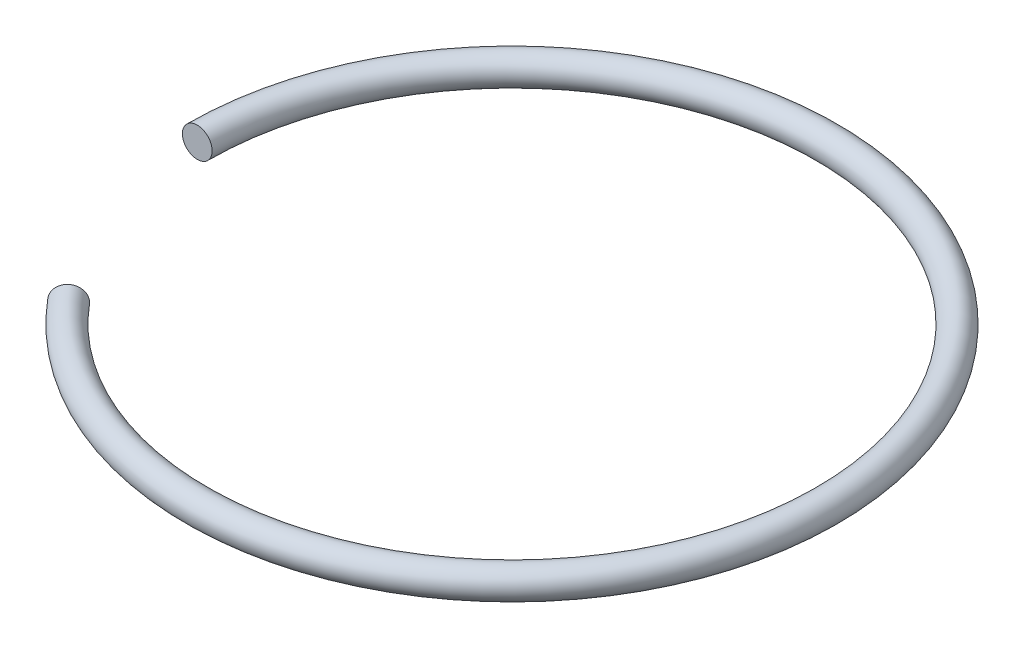
ISO-10303-21;
HEADER;
FILE_DESCRIPTION(('STEP AP214'),'2;1');
FILE_NAME('part.step','',(''),(''),'','','');
FILE_SCHEMA(('AUTOMOTIVE_DESIGN { 1 0 10303 214 1 1 1 1 }'));
ENDSEC;
DATA;
#1=APPLICATION_CONTEXT('core data for automotive mechanical design processes');
#2=APPLICATION_PROTOCOL_DEFINITION('international standard','automotive_design',2000,#1);
#3=PRODUCT_CONTEXT('',#1,'mechanical');
#4=PRODUCT('Part','Part','',(#3));
#5=PRODUCT_RELATED_PRODUCT_CATEGORY('part','',(#4));
#6=PRODUCT_DEFINITION_FORMATION('','',#4);
#7=PRODUCT_DEFINITION_CONTEXT('part definition',#1,'design');
#8=PRODUCT_DEFINITION('design','',#6,#7);
#9=PRODUCT_DEFINITION_SHAPE('','',#8);
#10=(LENGTH_UNIT() NAMED_UNIT(*) SI_UNIT(.MILLI.,.METRE.));
#11=(NAMED_UNIT(*) PLANE_ANGLE_UNIT() SI_UNIT($,.RADIAN.));
#12=(NAMED_UNIT(*) SI_UNIT($,.STERADIAN.) SOLID_ANGLE_UNIT());
#13=UNCERTAINTY_MEASURE_WITH_UNIT(LENGTH_MEASURE(1.E-05),#10,'distance_accuracy_value','');
#14=(GEOMETRIC_REPRESENTATION_CONTEXT(3) GLOBAL_UNCERTAINTY_ASSIGNED_CONTEXT((#13)) GLOBAL_UNIT_ASSIGNED_CONTEXT((#10,
#11,#12)) REPRESENTATION_CONTEXT('',''));
#15=CARTESIAN_POINT('',(0.,0.,0.));
#16=DIRECTION('',(0.,0.,1.));
#17=DIRECTION('',(1.,0.,0.));
#18=AXIS2_PLACEMENT_3D('',#15,#16,#17);
#19=CARTESIAN_POINT('',(0.,2.794,0.));
#20=DIRECTION('',(0.,0.,1.));
#21=DIRECTION('',(1.,0.,0.));
#22=AXIS2_PLACEMENT_3D('',#19,#20,#21);
#23=PLANE('',#22);
#24=CARTESIAN_POINT('',(-2.55905,0.381,0.));
#25=CARTESIAN_POINT('',(-2.55905899992696,0.366769642926091,0.));
#26=CARTESIAN_POINT('',(-2.56148449231307,0.35245171970838,0.));
#27=CARTESIAN_POINT('',(-2.57093379429475,0.325472860189243,0.));
#28=CARTESIAN_POINT('',(-2.57795760389031,0.312811923887817,0.));
#29=CARTESIAN_POINT('',(-2.59580126434134,0.290516101747297,0.));
#30=CARTESIAN_POINT('',(-2.60662111519689,0.28088121590828,0.));
#31=CARTESIAN_POINT('',(-2.63083979269764,0.265739316925006,0.));
#32=CARTESIAN_POINT('',(-2.64423861934284,0.26023230378075,0.));
#33=CARTESIAN_POINT('',(-2.67210386450994,0.253963137356641,0.));
#34=CARTESIAN_POINT('',(-2.68657028303185,0.253200984076787,0.));
#35=CARTESIAN_POINT('',(-2.71494001376165,0.256507449590689,0.));
#36=CARTESIAN_POINT('',(-2.72884332596954,0.260576068384445,0.));
#37=CARTESIAN_POINT('',(-2.75451899590066,0.273089318093971,0.));
#38=CARTESIAN_POINT('',(-2.7662913536239,0.28153394900974,0.));
#39=CARTESIAN_POINT('',(-2.78637901054135,0.301831385862719,0.));
#40=CARTESIAN_POINT('',(-2.79469430973557,0.313684191799928,0.));
#41=CARTESIAN_POINT('',(-2.80692615792845,0.339520794880101,0.));
#42=CARTESIAN_POINT('',(-2.8108427069271,0.353504592023065,0.));
#43=CARTESIAN_POINT('',(-2.81281833023764,0.372089694465364,0.));
#44=CARTESIAN_POINT('',(-2.81305282036116,0.376540547537074,0.));
#45=CARTESIAN_POINT('',(-2.81304100007304,0.39523035707391,0.));
#46=CARTESIAN_POINT('',(-2.81061550768693,0.409548280291621,0.));
#47=CARTESIAN_POINT('',(-2.80116620570525,0.436527139810758,0.));
#48=CARTESIAN_POINT('',(-2.79414239610969,0.449188076112183,0.));
#49=CARTESIAN_POINT('',(-2.77629873565866,0.471483898252703,0.));
#50=CARTESIAN_POINT('',(-2.7654788848031,0.481118784091721,0.));
#51=CARTESIAN_POINT('',(-2.74126020730236,0.496260683074995,0.));
#52=CARTESIAN_POINT('',(-2.72786138065716,0.50176769621925,0.));
#53=CARTESIAN_POINT('',(-2.69999613549006,0.50803686264336,0.));
#54=CARTESIAN_POINT('',(-2.68552971696815,0.508799015923214,0.));
#55=CARTESIAN_POINT('',(-2.65715998623835,0.505492550409311,0.));
#56=CARTESIAN_POINT('',(-2.64325667403046,0.501423931615555,0.));
#57=CARTESIAN_POINT('',(-2.61758100409934,0.48891068190603,0.));
#58=CARTESIAN_POINT('',(-2.6058086463761,0.48046605099026,0.));
#59=CARTESIAN_POINT('',(-2.58572098945865,0.460168614137282,0.));
#60=CARTESIAN_POINT('',(-2.57740569026443,0.448315808200072,0.));
#61=CARTESIAN_POINT('',(-2.56517384207155,0.422479205119899,0.));
#62=CARTESIAN_POINT('',(-2.56125729307289,0.408495407976936,0.));
#63=CARTESIAN_POINT('',(-2.55928166976236,0.389910305534636,0.));
#64=CARTESIAN_POINT('',(-2.55904717963883,0.385459452462927,0.));
#65=CARTESIAN_POINT('',(-2.55905,0.381,0.));
#66=B_SPLINE_CURVE_WITH_KNOTS('',3,(#24,#25,#26,#27,#28,#29,#30,#31,#32,#33,#34,#35,#36,#37,#38,
#39,#40,#41,#42,#43,#44,#45,#46,#47,#48,#49,#50,#51,#52,#53,#54,#55,#56,#57,#58,#59,#60,#61,#62,
#63,#64,#65),.UNSPECIFIED.,.T.,.F.,(4,2,2,2,2,2,2,2,2,2,2,2,2,2,2,2,2,2,2,2,4),(0.,
0.0426429642402328,0.0852859284804657,0.127928892721775,0.170571856963084,0.213214821204393,
0.255857785445702,0.298500749687011,0.34114371392832,0.383786678169629,0.397149959984689,
0.439792924224922,0.482435888465155,0.525078852706464,0.567721816947773,0.610364781189083,
0.653007745430392,0.6956507096717,0.73829367391301,0.780936638154319,0.794299919969379),.UNSPECIFIED.);
#67=CARTESIAN_POINT('',(-2.55905,0.381,0.));
#68=VERTEX_POINT('',#67);
#69=EDGE_CURVE('E18',#68,#68,#66,.T.);
#70=ORIENTED_EDGE('',*,*,#69,.F.);
#71=EDGE_LOOP('',(#70));
#72=FACE_BOUND('',#71,.T.);
#73=ADVANCED_FACE('F14',(#72),#23,.T.);
#74=CARTESIAN_POINT('',(0.,2.794,0.));
#75=DIRECTION('',(0.64278760968653,0.,0.766044443118986));
#76=DIRECTION('',(0.766044443118986,0.,-0.64278760968653));
#77=AXIS2_PLACEMENT_3D('',#74,#75,#76);
#78=PLANE('',#77);
#79=CARTESIAN_POINT('',(-2.15492132071586,0.381,1.80819368542869));
#80=CARTESIAN_POINT('',(-2.15491442637183,0.36676964292609,1.80818790038716));
#81=CARTESIAN_POINT('',(-2.15305639140762,0.35245171970838,1.80662882393397));
#82=CARTESIAN_POINT('',(-2.1458178061332,0.325472860189243,1.80055492969996));
#83=CARTESIAN_POINT('',(-2.14043725582299,0.312811923887817,1.79604011191914));
#84=CARTESIAN_POINT('',(-2.12676821888958,0.290516101747297,1.78457042806977));
#85=CARTESIAN_POINT('',(-2.11847973226631,0.28088121590828,1.77761556200116));
#86=CARTESIAN_POINT('',(-2.09992714894717,0.265739316925006,1.76204809618068));
#87=CARTESIAN_POINT('',(-2.0896630522513,0.26023230378075,1.75343549642882));
#88=CARTESIAN_POINT('',(-2.0683170360349,0.253963137356641,1.73552406209452));
#89=CARTESIAN_POINT('',(-2.05723511651435,0.253200984076787,1.7262252275121));
#90=CARTESIAN_POINT('',(-2.03550264193601,0.256507449590689,1.70798951610884));
#91=CARTESIAN_POINT('',(-2.02485208687821,0.260576068384445,1.69905263928801));
#92=CARTESIAN_POINT('',(-2.00518338260411,0.273089318093971,1.68254863678588));
#93=CARTESIAN_POINT('',(-1.99616523338782,0.28153394900974,1.67498151110459));
#94=CARTESIAN_POINT('',(-1.98077719543092,0.301831385862719,1.66206941413041));
#95=CARTESIAN_POINT('',(-1.97440730669032,0.313684191799928,1.65672444283753));
#96=CARTESIAN_POINT('',(-1.96503716735309,0.339520794880101,1.64886196237559));
#97=CARTESIAN_POINT('',(-1.96203691675647,0.353504592023065,1.64634445320652));
#98=CARTESIAN_POINT('',(-1.96052350149774,0.372089694465364,1.6450745470211));
#99=CARTESIAN_POINT('',(-1.96034387164164,0.376540547537074,1.6449238196751));
#100=CARTESIAN_POINT('',(-1.96035292650768,0.39523035707391,1.64493141760985));
#101=CARTESIAN_POINT('',(-1.96221096147189,0.409548280291621,1.64649049406303));
#102=CARTESIAN_POINT('',(-1.9694495467463,0.436527139810757,1.65256438829704));
#103=CARTESIAN_POINT('',(-1.97483009705651,0.449188076112183,1.65707920607787));
#104=CARTESIAN_POINT('',(-1.98849913398992,0.471483898252703,1.66854888992724));
#105=CARTESIAN_POINT('',(-1.9967876206132,0.481118784091721,1.67550375599585));
#106=CARTESIAN_POINT('',(-2.01534020393233,0.496260683074994,1.69107122181633));
#107=CARTESIAN_POINT('',(-2.0256043006282,0.50176769621925,1.69968382156819));
#108=CARTESIAN_POINT('',(-2.04695031684461,0.50803686264336,1.71759525590248));
#109=CARTESIAN_POINT('',(-2.05803223636515,0.508799015923213,1.72689409048491));
#110=CARTESIAN_POINT('',(-2.0797647109435,0.505492550409311,1.74512980188817));
#111=CARTESIAN_POINT('',(-2.0904152660013,0.501423931615555,1.754066678709));
#112=CARTESIAN_POINT('',(-2.11008397027539,0.48891068190603,1.77057068121113));
#113=CARTESIAN_POINT('',(-2.11910211949169,0.480466050990261,1.77813780689242));
#114=CARTESIAN_POINT('',(-2.13449015744858,0.460168614137282,1.79104990386659));
#115=CARTESIAN_POINT('',(-2.14086004618918,0.448315808200073,1.79639487515947));
#116=CARTESIAN_POINT('',(-2.15023018552641,0.4224792051199,1.80425735562142));
#117=CARTESIAN_POINT('',(-2.15323043612304,0.408495407976936,1.80677486479049));
#118=CARTESIAN_POINT('',(-2.15474385138177,0.389910305534636,1.80804477097591));
#119=CARTESIAN_POINT('',(-2.15492348123786,0.385459452462927,1.8081954983219));
#120=CARTESIAN_POINT('',(-2.15492132071586,0.381,1.80819368542869));
#121=B_SPLINE_CURVE_WITH_KNOTS('',3,(#79,#80,#81,#82,#83,#84,#85,#86,#87,#88,#89,#90,#91,#92,
#93,#94,#95,#96,#97,#98,#99,#100,#101,#102,#103,#104,#105,#106,#107,#108,#109,#110,#111,#112,
#113,#114,#115,#116,#117,#118,#119,#120),.UNSPECIFIED.,.T.,.F.,(4,2,2,2,2,2,2,2,2,2,2,2,2,2,2,2,
2,2,2,2,4),(0.,0.0426429642402328,0.0852859284804655,0.127928892721775,0.170571856963084,
0.213214821204393,0.255857785445702,0.298500749687011,0.34114371392832,0.383786678169629,
0.397149959984689,0.439792924224922,0.482435888465155,0.525078852706464,0.567721816947773,
0.610364781189082,0.653007745430391,0.6956507096717,0.738293673913009,0.780936638154319,
0.794299919969379),.UNSPECIFIED.);
#122=CARTESIAN_POINT('',(-2.15492132071586,0.381,1.80819368542869));
#123=VERTEX_POINT('',#122);
#124=EDGE_CURVE('E10',#123,#123,#121,.T.);
#125=ORIENTED_EDGE('',*,*,#124,.F.);
#126=EDGE_LOOP('',(#125));
#127=FACE_BOUND('',#126,.T.);
#128=ADVANCED_FACE('F34',(#127),#78,.F.);
#129=CARTESIAN_POINT('',(0.,0.381,0.));
#130=DIRECTION('',(0.,-1.,0.));
#131=DIRECTION('',(0.,0.,1.));
#132=AXIS2_PLACEMENT_3D('',#129,#130,#131);
#133=TOROIDAL_SURFACE('',#132,2.68605,0.127000000000001);
#134=ORIENTED_EDGE('',*,*,#124,.T.);
#135=EDGE_LOOP('',(#134));
#136=FACE_BOUND('',#135,.T.);
#137=ORIENTED_EDGE('',*,*,#69,.T.);
#138=EDGE_LOOP('',(#137));
#139=FACE_BOUND('',#138,.T.);
#140=ADVANCED_FACE('F36',(#136,#139),#133,.T.);
#141=CLOSED_SHELL('',(#73,#128,#140));
#142=MANIFOLD_SOLID_BREP('B1',#141);
#143=ADVANCED_BREP_SHAPE_REPRESENTATION('',(#18,#142),#14);
#144=SHAPE_DEFINITION_REPRESENTATION(#9,#143);
ENDSEC;
END-ISO-10303-21;
